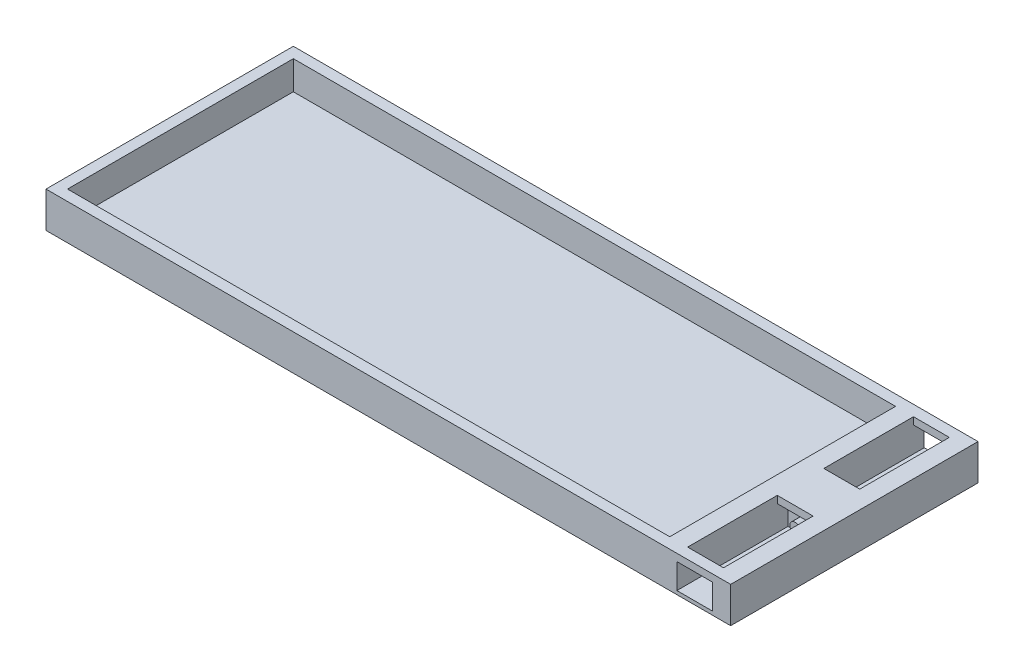
ISO-10303-21;
HEADER;
FILE_DESCRIPTION(('STEP AP214'),'2;1');
FILE_NAME('part.step','',(''),(''),'','','');
FILE_SCHEMA(('AUTOMOTIVE_DESIGN { 1 0 10303 214 1 1 1 1 }'));
ENDSEC;
DATA;
#1=APPLICATION_CONTEXT('core data for automotive mechanical design processes');
#2=APPLICATION_PROTOCOL_DEFINITION('international standard','automotive_design',2000,#1);
#3=PRODUCT_CONTEXT('',#1,'mechanical');
#4=PRODUCT('Part','Part','',(#3));
#5=PRODUCT_RELATED_PRODUCT_CATEGORY('part','',(#4));
#6=PRODUCT_DEFINITION_FORMATION('','',#4);
#7=PRODUCT_DEFINITION_CONTEXT('part definition',#1,'design');
#8=PRODUCT_DEFINITION('design','',#6,#7);
#9=PRODUCT_DEFINITION_SHAPE('','',#8);
#10=(LENGTH_UNIT() NAMED_UNIT(*) SI_UNIT(.MILLI.,.METRE.));
#11=(NAMED_UNIT(*) PLANE_ANGLE_UNIT() SI_UNIT($,.RADIAN.));
#12=(NAMED_UNIT(*) SI_UNIT($,.STERADIAN.) SOLID_ANGLE_UNIT());
#13=UNCERTAINTY_MEASURE_WITH_UNIT(LENGTH_MEASURE(1.E-05),#10,'distance_accuracy_value','');
#14=(GEOMETRIC_REPRESENTATION_CONTEXT(3) GLOBAL_UNCERTAINTY_ASSIGNED_CONTEXT((#13)) GLOBAL_UNIT_ASSIGNED_CONTEXT((#10,
#11,#12)) REPRESENTATION_CONTEXT('',''));
#15=CARTESIAN_POINT('',(0.,0.,0.));
#16=DIRECTION('',(0.,0.,1.));
#17=DIRECTION('',(1.,0.,0.));
#18=AXIS2_PLACEMENT_3D('',#15,#16,#17);
#19=CARTESIAN_POINT('',(-87.,10.,-34.5));
#20=DIRECTION('',(1.,0.,0.));
#21=DIRECTION('',(0.,0.,-1.));
#22=AXIS2_PLACEMENT_3D('',#19,#20,#21);
#23=PLANE('',#22);
#24=DIRECTION('',(0.,-1.,0.));
#25=VECTOR('',#24,1.);
#26=CARTESIAN_POINT('',(-87.,0.,-5.));
#27=LINE('',#26,#25);
#28=CARTESIAN_POINT('',(-87.,5.,-5.));
#29=VERTEX_POINT('',#28);
#30=CARTESIAN_POINT('',(-87.,0.,-5.));
#31=VERTEX_POINT('',#30);
#32=EDGE_CURVE('E59',#29,#31,#27,.T.);
#33=ORIENTED_EDGE('',*,*,#32,.F.);
#34=DIRECTION('',(0.,0.,-1.));
#35=VECTOR('',#34,1.);
#36=CARTESIAN_POINT('',(-87.,5.,-5.));
#37=LINE('',#36,#35);
#38=CARTESIAN_POINT('',(-87.,5.,5.));
#39=VERTEX_POINT('',#38);
#40=EDGE_CURVE('E248',#39,#29,#37,.T.);
#41=ORIENTED_EDGE('',*,*,#40,.F.);
#42=DIRECTION('',(0.,1.,0.));
#43=VECTOR('',#42,1.);
#44=CARTESIAN_POINT('',(-87.,5.,5.));
#45=LINE('',#44,#43);
#46=CARTESIAN_POINT('',(-87.,0.,5.));
#47=VERTEX_POINT('',#46);
#48=EDGE_CURVE('E65',#47,#39,#45,.T.);
#49=ORIENTED_EDGE('',*,*,#48,.F.);
#50=DIRECTION('',(0.,0.,1.));
#51=VECTOR('',#50,1.);
#52=CARTESIAN_POINT('',(-87.,0.,-34.5));
#53=LINE('',#52,#51);
#54=CARTESIAN_POINT('',(-87.,0.,34.5));
#55=VERTEX_POINT('',#54);
#56=EDGE_CURVE('E413',#47,#55,#53,.T.);
#57=ORIENTED_EDGE('',*,*,#56,.T.);
#58=DIRECTION('',(0.,-1.,0.));
#59=VECTOR('',#58,1.);
#60=CARTESIAN_POINT('',(-87.,10.,34.5));
#61=LINE('',#60,#59);
#62=CARTESIAN_POINT('',(-87.,10.,34.5));
#63=VERTEX_POINT('',#62);
#64=EDGE_CURVE('E437',#63,#55,#61,.T.);
#65=ORIENTED_EDGE('',*,*,#64,.F.);
#66=DIRECTION('',(0.,0.,1.));
#67=VECTOR('',#66,1.);
#68=CARTESIAN_POINT('',(-87.,10.,-34.5));
#69=LINE('',#68,#67);
#70=CARTESIAN_POINT('',(-87.,10.,-34.5));
#71=VERTEX_POINT('',#70);
#72=EDGE_CURVE('E416',#71,#63,#69,.T.);
#73=ORIENTED_EDGE('',*,*,#72,.F.);
#74=DIRECTION('',(0.,-1.,0.));
#75=VECTOR('',#74,1.);
#76=CARTESIAN_POINT('',(-87.,10.,-34.5));
#77=LINE('',#76,#75);
#78=CARTESIAN_POINT('',(-87.,0.,-34.5));
#79=VERTEX_POINT('',#78);
#80=EDGE_CURVE('E52',#71,#79,#77,.T.);
#81=ORIENTED_EDGE('',*,*,#80,.T.);
#82=EDGE_CURVE('E425',#79,#31,#53,.T.);
#83=ORIENTED_EDGE('',*,*,#82,.T.);
#84=EDGE_LOOP('',(#33,#41,#49,#57,#65,#73,#81,#83));
#85=FACE_BOUND('',#84,.T.);
#86=ADVANCED_FACE('F45',(#85),#23,.F.);
#87=CARTESIAN_POINT('',(99.,0.,31.5));
#88=DIRECTION('',(-1.,0.,0.));
#89=DIRECTION('',(0.,0.,1.));
#90=AXIS2_PLACEMENT_3D('',#87,#88,#89);
#91=PLANE('',#90);
#92=DIRECTION('',(0.,1.,0.));
#93=VECTOR('',#92,1.);
#94=CARTESIAN_POINT('',(99.,8.,3.49999999999998));
#95=LINE('',#94,#93);
#96=CARTESIAN_POINT('',(99.,1.,3.49999999999998));
#97=VERTEX_POINT('',#96);
#98=CARTESIAN_POINT('',(99.,8.,3.49999999999998));
#99=VERTEX_POINT('',#98);
#100=EDGE_CURVE('E338',#97,#99,#95,.T.);
#101=ORIENTED_EDGE('',*,*,#100,.F.);
#102=DIRECTION('',(0.,0.,-1.));
#103=VECTOR('',#102,1.);
#104=CARTESIAN_POINT('',(99.,1.,34.5));
#105=LINE('',#104,#103);
#106=CARTESIAN_POINT('',(99.,1.,34.5));
#107=VERTEX_POINT('',#106);
#108=EDGE_CURVE('E283',#107,#97,#105,.T.);
#109=ORIENTED_EDGE('',*,*,#108,.F.);
#110=DIRECTION('',(0.,-1.,0.));
#111=VECTOR('',#110,1.);
#112=CARTESIAN_POINT('',(99.,8.,34.5));
#113=LINE('',#112,#111);
#114=CARTESIAN_POINT('',(99.,8.,34.5));
#115=VERTEX_POINT('',#114);
#116=EDGE_CURVE('E324',#115,#107,#113,.T.);
#117=ORIENTED_EDGE('',*,*,#116,.F.);
#118=DIRECTION('',(0.,0.,-1.));
#119=VECTOR('',#118,1.);
#120=CARTESIAN_POINT('',(99.,8.,34.501));
#121=LINE('',#120,#119);
#122=CARTESIAN_POINT('',(99.,8.,31.5));
#123=VERTEX_POINT('',#122);
#124=EDGE_CURVE('E329',#115,#123,#121,.T.);
#125=ORIENTED_EDGE('',*,*,#124,.T.);
#126=DIRECTION('',(0.,1.,0.));
#127=VECTOR('',#126,1.);
#128=CARTESIAN_POINT('',(99.,0.,31.5));
#129=LINE('',#128,#127);
#130=CARTESIAN_POINT('',(99.,10.,31.5));
#131=VERTEX_POINT('',#130);
#132=EDGE_CURVE('E357',#123,#131,#129,.T.);
#133=ORIENTED_EDGE('',*,*,#132,.T.);
#134=DIRECTION('',(0.,0.,1.));
#135=VECTOR('',#134,1.);
#136=CARTESIAN_POINT('',(99.,10.,31.5));
#137=LINE('',#136,#135);
#138=CARTESIAN_POINT('',(99.,10.,6.5));
#139=VERTEX_POINT('',#138);
#140=EDGE_CURVE('E331',#139,#131,#137,.T.);
#141=ORIENTED_EDGE('',*,*,#140,.F.);
#142=DIRECTION('',(0.,1.,0.));
#143=VECTOR('',#142,1.);
#144=CARTESIAN_POINT('',(99.,0.,6.5));
#145=LINE('',#144,#143);
#146=CARTESIAN_POINT('',(99.,8.,6.5));
#147=VERTEX_POINT('',#146);
#148=EDGE_CURVE('E356',#147,#139,#145,.T.);
#149=ORIENTED_EDGE('',*,*,#148,.F.);
#150=DIRECTION('',(0.,0.,1.));
#151=VECTOR('',#150,1.);
#152=CARTESIAN_POINT('',(99.,8.,3.49999999999998));
#153=LINE('',#152,#151);
#154=EDGE_CURVE('E332',#99,#147,#153,.T.);
#155=ORIENTED_EDGE('',*,*,#154,.F.);
#156=EDGE_LOOP('',(#101,#109,#117,#125,#133,#141,#149,#155));
#157=FACE_BOUND('',#156,.T.);
#158=ADVANCED_FACE('F478',(#157),#91,.T.);
#159=CARTESIAN_POINT('',(89.,0.,6.5));
#160=DIRECTION('',(1.,0.,0.));
#161=DIRECTION('',(0.,0.,-1.));
#162=AXIS2_PLACEMENT_3D('',#159,#160,#161);
#163=PLANE('',#162);
#164=DIRECTION('',(0.,1.,0.));
#165=VECTOR('',#164,1.);
#166=CARTESIAN_POINT('',(89.,8.,34.5));
#167=LINE('',#166,#165);
#168=CARTESIAN_POINT('',(89.,1.,34.5));
#169=VERTEX_POINT('',#168);
#170=CARTESIAN_POINT('',(89.,8.,34.5));
#171=VERTEX_POINT('',#170);
#172=EDGE_CURVE('E318',#169,#171,#167,.T.);
#173=ORIENTED_EDGE('',*,*,#172,.F.);
#174=DIRECTION('',(0.,0.,-1.));
#175=VECTOR('',#174,1.);
#176=CARTESIAN_POINT('',(89.,1.,34.5));
#177=LINE('',#176,#175);
#178=CARTESIAN_POINT('',(89.,1.,3.49999999999998));
#179=VERTEX_POINT('',#178);
#180=EDGE_CURVE('E279',#169,#179,#177,.T.);
#181=ORIENTED_EDGE('',*,*,#180,.T.);
#182=DIRECTION('',(0.,-1.,0.));
#183=VECTOR('',#182,1.);
#184=CARTESIAN_POINT('',(89.,8.,3.49999999999998));
#185=LINE('',#184,#183);
#186=CARTESIAN_POINT('',(89.,8.,3.49999999999998));
#187=VERTEX_POINT('',#186);
#188=EDGE_CURVE('E334',#187,#179,#185,.T.);
#189=ORIENTED_EDGE('',*,*,#188,.F.);
#190=DIRECTION('',(0.,0.,1.));
#191=VECTOR('',#190,1.);
#192=CARTESIAN_POINT('',(89.,8.,3.49999999999998));
#193=LINE('',#192,#191);
#194=CARTESIAN_POINT('',(89.,8.,6.49999999999998));
#195=VERTEX_POINT('',#194);
#196=EDGE_CURVE('E301',#187,#195,#193,.T.);
#197=ORIENTED_EDGE('',*,*,#196,.T.);
#198=DIRECTION('',(0.,1.,0.));
#199=VECTOR('',#198,1.);
#200=CARTESIAN_POINT('',(89.,0.,6.5));
#201=LINE('',#200,#199);
#202=CARTESIAN_POINT('',(89.,10.,6.5));
#203=VERTEX_POINT('',#202);
#204=EDGE_CURVE('E362',#195,#203,#201,.T.);
#205=ORIENTED_EDGE('',*,*,#204,.T.);
#206=DIRECTION('',(0.,0.,-1.));
#207=VECTOR('',#206,1.);
#208=CARTESIAN_POINT('',(89.,10.,6.5));
#209=LINE('',#208,#207);
#210=CARTESIAN_POINT('',(89.,10.,31.5));
#211=VERTEX_POINT('',#210);
#212=EDGE_CURVE('E350',#211,#203,#209,.T.);
#213=ORIENTED_EDGE('',*,*,#212,.F.);
#214=DIRECTION('',(0.,1.,0.));
#215=VECTOR('',#214,1.);
#216=CARTESIAN_POINT('',(89.,0.,31.5));
#217=LINE('',#216,#215);
#218=CARTESIAN_POINT('',(89.,8.,31.5));
#219=VERTEX_POINT('',#218);
#220=EDGE_CURVE('E360',#219,#211,#217,.T.);
#221=ORIENTED_EDGE('',*,*,#220,.F.);
#222=DIRECTION('',(0.,0.,-1.));
#223=VECTOR('',#222,1.);
#224=CARTESIAN_POINT('',(89.,8.,34.501));
#225=LINE('',#224,#223);
#226=EDGE_CURVE('E327',#171,#219,#225,.T.);
#227=ORIENTED_EDGE('',*,*,#226,.F.);
#228=EDGE_LOOP('',(#173,#181,#189,#197,#205,#213,#221,#227));
#229=FACE_BOUND('',#228,.T.);
#230=ADVANCED_FACE('F484',(#229),#163,.T.);
#231=CARTESIAN_POINT('',(0.,0.,3.49999999999998));
#232=DIRECTION('',(0.,0.,1.));
#233=DIRECTION('',(1.,0.,0.));
#234=AXIS2_PLACEMENT_3D('',#231,#232,#233);
#235=PLANE('',#234);
#236=CARTESIAN_POINT('',(94.,4.5,3.49999999999998));
#237=DIRECTION('',(0.,0.,1.));
#238=DIRECTION('',(1.,0.,0.));
#239=AXIS2_PLACEMENT_3D('',#236,#237,#238);
#240=CIRCLE('',#239,1.5);
#241=CARTESIAN_POINT('',(95.5,4.5,3.49999999999998));
#242=VERTEX_POINT('',#241);
#243=EDGE_CURVE('E254',#242,#242,#240,.T.);
#244=ORIENTED_EDGE('',*,*,#243,.F.);
#245=EDGE_LOOP('',(#244));
#246=FACE_BOUND('',#245,.T.);
#247=ORIENTED_EDGE('',*,*,#188,.T.);
#248=DIRECTION('',(-1.,0.,0.));
#249=VECTOR('',#248,1.);
#250=CARTESIAN_POINT('',(89.,1.,3.49999999999998));
#251=LINE('',#250,#249);
#252=EDGE_CURVE('E276',#97,#179,#251,.T.);
#253=ORIENTED_EDGE('',*,*,#252,.F.);
#254=ORIENTED_EDGE('',*,*,#100,.T.);
#255=DIRECTION('',(-1.,0.,0.));
#256=VECTOR('',#255,1.);
#257=CARTESIAN_POINT('',(99.,8.,3.49999999999998));
#258=LINE('',#257,#256);
#259=EDGE_CURVE('E341',#99,#187,#258,.T.);
#260=ORIENTED_EDGE('',*,*,#259,.T.);
#261=EDGE_LOOP('',(#247,#253,#254,#260));
#262=FACE_BOUND('',#261,.T.);
#263=ADVANCED_FACE('F491',(#246,#262),#235,.T.);
#264=CARTESIAN_POINT('',(0.,0.,0.));
#265=DIRECTION('',(0.,-1.,0.));
#266=DIRECTION('',(0.,0.,-1.));
#267=AXIS2_PLACEMENT_3D('',#264,#265,#266);
#268=PLANE('',#267);
#269=ORIENTED_EDGE('',*,*,#82,.F.);
#270=DIRECTION('',(-1.,0.,0.));
#271=VECTOR('',#270,1.);
#272=CARTESIAN_POINT('',(84.,0.,-34.5));
#273=LINE('',#272,#271);
#274=CARTESIAN_POINT('',(104.,0.,-34.5));
#275=VERTEX_POINT('',#274);
#276=EDGE_CURVE('E417',#275,#79,#273,.T.);
#277=ORIENTED_EDGE('',*,*,#276,.F.);
#278=DIRECTION('',(0.,0.,-1.));
#279=VECTOR('',#278,1.);
#280=CARTESIAN_POINT('',(104.,0.,-34.5));
#281=LINE('',#280,#279);
#282=CARTESIAN_POINT('',(104.,0.,34.5));
#283=VERTEX_POINT('',#282);
#284=EDGE_CURVE('E429',#283,#275,#281,.T.);
#285=ORIENTED_EDGE('',*,*,#284,.F.);
#286=DIRECTION('',(1.,0.,0.));
#287=VECTOR('',#286,1.);
#288=CARTESIAN_POINT('',(84.,0.,34.5));
#289=LINE('',#288,#287);
#290=EDGE_CURVE('E427',#55,#283,#289,.T.);
#291=ORIENTED_EDGE('',*,*,#290,.F.);
#292=ORIENTED_EDGE('',*,*,#56,.F.);
#293=DIRECTION('',(1.,0.,0.));
#294=VECTOR('',#293,1.);
#295=CARTESIAN_POINT('',(-90.,0.,5.));
#296=LINE('',#295,#294);
#297=CARTESIAN_POINT('',(-90.,0.,5.));
#298=VERTEX_POINT('',#297);
#299=EDGE_CURVE('E235',#298,#47,#296,.T.);
#300=ORIENTED_EDGE('',*,*,#299,.F.);
#301=DIRECTION('',(0.,0.,1.));
#302=VECTOR('',#301,1.);
#303=CARTESIAN_POINT('',(-90.,0.,5.));
#304=LINE('',#303,#302);
#305=CARTESIAN_POINT('',(-90.,0.,-5.));
#306=VERTEX_POINT('',#305);
#307=EDGE_CURVE('E228',#306,#298,#304,.T.);
#308=ORIENTED_EDGE('',*,*,#307,.F.);
#309=DIRECTION('',(1.,0.,0.));
#310=VECTOR('',#309,1.);
#311=CARTESIAN_POINT('',(-90.,0.,-5.));
#312=LINE('',#311,#310);
#313=EDGE_CURVE('E233',#306,#31,#312,.T.);
#314=ORIENTED_EDGE('',*,*,#313,.T.);
#315=EDGE_LOOP('',(#269,#277,#285,#291,#292,#300,#308,#314));
#316=FACE_BOUND('',#315,.T.);
#317=ADVANCED_FACE('F231',(#316),#268,.T.);
#318=CARTESIAN_POINT('',(89.,0.,-6.5));
#319=DIRECTION('',(0.,0.,1.));
#320=DIRECTION('',(1.,0.,0.));
#321=AXIS2_PLACEMENT_3D('',#318,#319,#320);
#322=PLANE('',#321);
#323=DIRECTION('',(-1.,0.,0.));
#324=VECTOR('',#323,1.);
#325=CARTESIAN_POINT('',(99.,8.,-6.49999999999998));
#326=LINE('',#325,#324);
#327=CARTESIAN_POINT('',(99.,8.,-6.49999999999998));
#328=VERTEX_POINT('',#327);
#329=CARTESIAN_POINT('',(89.,8.,-6.49999999999998));
#330=VERTEX_POINT('',#329);
#331=EDGE_CURVE('E285',#328,#330,#326,.T.);
#332=ORIENTED_EDGE('',*,*,#331,.T.);
#333=DIRECTION('',(0.,1.,0.));
#334=VECTOR('',#333,1.);
#335=CARTESIAN_POINT('',(89.,0.,-6.5));
#336=LINE('',#335,#334);
#337=CARTESIAN_POINT('',(89.,10.,-6.5));
#338=VERTEX_POINT('',#337);
#339=EDGE_CURVE('E380',#330,#338,#336,.T.);
#340=ORIENTED_EDGE('',*,*,#339,.T.);
#341=DIRECTION('',(1.,0.,0.));
#342=VECTOR('',#341,1.);
#343=CARTESIAN_POINT('',(89.,10.,-6.5));
#344=LINE('',#343,#342);
#345=CARTESIAN_POINT('',(99.,10.,-6.5));
#346=VERTEX_POINT('',#345);
#347=EDGE_CURVE('E373',#338,#346,#344,.T.);
#348=ORIENTED_EDGE('',*,*,#347,.T.);
#349=DIRECTION('',(0.,1.,0.));
#350=VECTOR('',#349,1.);
#351=CARTESIAN_POINT('',(99.,0.,-6.5));
#352=LINE('',#351,#350);
#353=EDGE_CURVE('E377',#328,#346,#352,.T.);
#354=ORIENTED_EDGE('',*,*,#353,.F.);
#355=EDGE_LOOP('',(#332,#340,#348,#354));
#356=FACE_BOUND('',#355,.T.);
#357=ADVANCED_FACE('F498',(#356),#322,.F.);
#358=CARTESIAN_POINT('',(84.,10.,34.5));
#359=DIRECTION('',(0.,0.,-1.));
#360=DIRECTION('',(-1.,0.,0.));
#361=AXIS2_PLACEMENT_3D('',#358,#359,#360);
#362=PLANE('',#361);
#363=ORIENTED_EDGE('',*,*,#116,.T.);
#364=DIRECTION('',(-1.,0.,0.));
#365=VECTOR('',#364,1.);
#366=CARTESIAN_POINT('',(89.,1.,34.5));
#367=LINE('',#366,#365);
#368=EDGE_CURVE('E277',#107,#169,#367,.T.);
#369=ORIENTED_EDGE('',*,*,#368,.T.);
#370=ORIENTED_EDGE('',*,*,#172,.T.);
#371=DIRECTION('',(1.,0.,0.));
#372=VECTOR('',#371,1.);
#373=CARTESIAN_POINT('',(99.,8.,34.5));
#374=LINE('',#373,#372);
#375=EDGE_CURVE('E321',#171,#115,#374,.T.);
#376=ORIENTED_EDGE('',*,*,#375,.T.);
#377=EDGE_LOOP('',(#363,#369,#370,#376));
#378=FACE_BOUND('',#377,.T.);
#379=ORIENTED_EDGE('',*,*,#290,.T.);
#380=DIRECTION('',(0.,-1.,0.));
#381=VECTOR('',#380,1.);
#382=CARTESIAN_POINT('',(104.,10.,34.5));
#383=LINE('',#382,#381);
#384=CARTESIAN_POINT('',(104.,10.,34.5));
#385=VERTEX_POINT('',#384);
#386=EDGE_CURVE('E434',#385,#283,#383,.T.);
#387=ORIENTED_EDGE('',*,*,#386,.F.);
#388=DIRECTION('',(1.,0.,0.));
#389=VECTOR('',#388,1.);
#390=CARTESIAN_POINT('',(-87.,10.,34.5));
#391=LINE('',#390,#389);
#392=EDGE_CURVE('E419',#63,#385,#391,.T.);
#393=ORIENTED_EDGE('',*,*,#392,.F.);
#394=ORIENTED_EDGE('',*,*,#64,.T.);
#395=EDGE_LOOP('',(#379,#387,#393,#394));
#396=FACE_BOUND('',#395,.T.);
#397=ADVANCED_FACE('F455',(#378,#396),#362,.F.);
#398=CARTESIAN_POINT('',(89.,0.,31.5));
#399=DIRECTION('',(0.,0.,-1.));
#400=DIRECTION('',(-1.,0.,0.));
#401=AXIS2_PLACEMENT_3D('',#398,#399,#400);
#402=PLANE('',#401);
#403=ORIENTED_EDGE('',*,*,#132,.F.);
#404=DIRECTION('',(1.,0.,0.));
#405=VECTOR('',#404,1.);
#406=CARTESIAN_POINT('',(99.,8.,31.5));
#407=LINE('',#406,#405);
#408=EDGE_CURVE('E315',#219,#123,#407,.T.);
#409=ORIENTED_EDGE('',*,*,#408,.F.);
#410=ORIENTED_EDGE('',*,*,#220,.T.);
#411=DIRECTION('',(-1.,0.,0.));
#412=VECTOR('',#411,1.);
#413=CARTESIAN_POINT('',(89.,10.,31.5));
#414=LINE('',#413,#412);
#415=EDGE_CURVE('E353',#131,#211,#414,.T.);
#416=ORIENTED_EDGE('',*,*,#415,.F.);
#417=EDGE_LOOP('',(#403,#409,#410,#416));
#418=FACE_BOUND('',#417,.T.);
#419=ADVANCED_FACE('F537',(#418),#402,.T.);
#420=CARTESIAN_POINT('',(0.,10.,0.));
#421=DIRECTION('',(0.,-1.,0.));
#422=DIRECTION('',(0.,0.,-1.));
#423=AXIS2_PLACEMENT_3D('',#420,#421,#422);
#424=PLANE('',#423);
#425=DIRECTION('',(0.,0.,-1.));
#426=VECTOR('',#425,1.);
#427=CARTESIAN_POINT('',(84.,10.,31.5));
#428=LINE('',#427,#426);
#429=CARTESIAN_POINT('',(84.,10.,31.5));
#430=VERTEX_POINT('',#429);
#431=CARTESIAN_POINT('',(84.,10.,-31.5));
#432=VERTEX_POINT('',#431);
#433=EDGE_CURVE('E392',#430,#432,#428,.T.);
#434=ORIENTED_EDGE('',*,*,#433,.F.);
#435=DIRECTION('',(1.,0.,0.));
#436=VECTOR('',#435,1.);
#437=CARTESIAN_POINT('',(-84.,10.,31.5));
#438=LINE('',#437,#436);
#439=CARTESIAN_POINT('',(-84.,10.,31.5));
#440=VERTEX_POINT('',#439);
#441=EDGE_CURVE('E399',#440,#430,#438,.T.);
#442=ORIENTED_EDGE('',*,*,#441,.F.);
#443=DIRECTION('',(0.,0.,1.));
#444=VECTOR('',#443,1.);
#445=CARTESIAN_POINT('',(-84.,10.,31.5));
#446=LINE('',#445,#444);
#447=CARTESIAN_POINT('',(-84.,10.,-31.5));
#448=VERTEX_POINT('',#447);
#449=EDGE_CURVE('E396',#448,#440,#446,.T.);
#450=ORIENTED_EDGE('',*,*,#449,.F.);
#451=DIRECTION('',(-1.,0.,0.));
#452=VECTOR('',#451,1.);
#453=CARTESIAN_POINT('',(-84.,10.,-31.5));
#454=LINE('',#453,#452);
#455=EDGE_CURVE('E394',#432,#448,#454,.T.);
#456=ORIENTED_EDGE('',*,*,#455,.F.);
#457=EDGE_LOOP('',(#434,#442,#450,#456));
#458=FACE_BOUND('',#457,.T.);
#459=DIRECTION('',(-1.,0.,0.));
#460=VECTOR('',#459,1.);
#461=CARTESIAN_POINT('',(0.,10.,-34.5));
#462=LINE('',#461,#460);
#463=CARTESIAN_POINT('',(104.,10.,-34.5));
#464=VERTEX_POINT('',#463);
#465=EDGE_CURVE('E414',#464,#71,#462,.T.);
#466=ORIENTED_EDGE('',*,*,#465,.T.);
#467=ORIENTED_EDGE('',*,*,#72,.T.);
#468=ORIENTED_EDGE('',*,*,#392,.T.);
#469=DIRECTION('',(0.,0.,-1.));
#470=VECTOR('',#469,1.);
#471=CARTESIAN_POINT('',(104.,10.,-34.5));
#472=LINE('',#471,#470);
#473=EDGE_CURVE('E421',#385,#464,#472,.T.);
#474=ORIENTED_EDGE('',*,*,#473,.T.);
#475=EDGE_LOOP('',(#466,#467,#468,#474));
#476=FACE_BOUND('',#475,.T.);
#477=DIRECTION('',(-1.,0.,0.));
#478=VECTOR('',#477,1.);
#479=CARTESIAN_POINT('',(89.,10.,-31.5));
#480=LINE('',#479,#478);
#481=CARTESIAN_POINT('',(99.,10.,-31.5));
#482=VERTEX_POINT('',#481);
#483=CARTESIAN_POINT('',(89.,10.,-31.5));
#484=VERTEX_POINT('',#483);
#485=EDGE_CURVE('E367',#482,#484,#480,.T.);
#486=ORIENTED_EDGE('',*,*,#485,.F.);
#487=DIRECTION('',(0.,0.,-1.));
#488=VECTOR('',#487,1.);
#489=CARTESIAN_POINT('',(99.,10.,-31.5));
#490=LINE('',#489,#488);
#491=EDGE_CURVE('E359',#346,#482,#490,.T.);
#492=ORIENTED_EDGE('',*,*,#491,.F.);
#493=ORIENTED_EDGE('',*,*,#347,.F.);
#494=DIRECTION('',(0.,0.,1.));
#495=VECTOR('',#494,1.);
#496=CARTESIAN_POINT('',(89.,10.,-6.5));
#497=LINE('',#496,#495);
#498=EDGE_CURVE('E370',#484,#338,#497,.T.);
#499=ORIENTED_EDGE('',*,*,#498,.F.);
#500=EDGE_LOOP('',(#486,#492,#493,#499));
#501=FACE_BOUND('',#500,.T.);
#502=ORIENTED_EDGE('',*,*,#140,.T.);
#503=ORIENTED_EDGE('',*,*,#415,.T.);
#504=ORIENTED_EDGE('',*,*,#212,.T.);
#505=DIRECTION('',(1.,0.,0.));
#506=VECTOR('',#505,1.);
#507=CARTESIAN_POINT('',(89.,10.,6.5));
#508=LINE('',#507,#506);
#509=EDGE_CURVE('E347',#203,#139,#508,.T.);
#510=ORIENTED_EDGE('',*,*,#509,.T.);
#511=EDGE_LOOP('',(#502,#503,#504,#510));
#512=FACE_BOUND('',#511,.T.);
#513=ADVANCED_FACE('F533',(#458,#476,#501,#512),#424,.F.);
#514=CARTESIAN_POINT('',(84.,10.,31.5));
#515=DIRECTION('',(-1.,0.,0.));
#516=DIRECTION('',(0.,0.,1.));
#517=AXIS2_PLACEMENT_3D('',#514,#515,#516);
#518=PLANE('',#517);
#519=DIRECTION('',(0.,-1.,0.));
#520=VECTOR('',#519,1.);
#521=CARTESIAN_POINT('',(84.,10.,-31.5));
#522=LINE('',#521,#520);
#523=CARTESIAN_POINT('',(84.,2.,-31.5));
#524=VERTEX_POINT('',#523);
#525=EDGE_CURVE('E410',#432,#524,#522,.T.);
#526=ORIENTED_EDGE('',*,*,#525,.T.);
#527=DIRECTION('',(0.,0.,-1.));
#528=VECTOR('',#527,1.);
#529=CARTESIAN_POINT('',(84.,2.,31.5));
#530=LINE('',#529,#528);
#531=CARTESIAN_POINT('',(84.,2.,31.5));
#532=VERTEX_POINT('',#531);
#533=EDGE_CURVE('E379',#532,#524,#530,.T.);
#534=ORIENTED_EDGE('',*,*,#533,.F.);
#535=DIRECTION('',(0.,-1.,0.));
#536=VECTOR('',#535,1.);
#537=CARTESIAN_POINT('',(84.,10.,31.5));
#538=LINE('',#537,#536);
#539=EDGE_CURVE('E401',#430,#532,#538,.T.);
#540=ORIENTED_EDGE('',*,*,#539,.F.);
#541=ORIENTED_EDGE('',*,*,#433,.T.);
#542=EDGE_LOOP('',(#526,#534,#540,#541));
#543=FACE_BOUND('',#542,.T.);
#544=ADVANCED_FACE('F529',(#543),#518,.T.);
#545=CARTESIAN_POINT('',(-84.,10.,-31.5));
#546=DIRECTION('',(0.,0.,1.));
#547=DIRECTION('',(1.,0.,0.));
#548=AXIS2_PLACEMENT_3D('',#545,#546,#547);
#549=PLANE('',#548);
#550=DIRECTION('',(0.,-1.,0.));
#551=VECTOR('',#550,1.);
#552=CARTESIAN_POINT('',(-84.,10.,-31.5));
#553=LINE('',#552,#551);
#554=CARTESIAN_POINT('',(-84.,2.,-31.5));
#555=VERTEX_POINT('',#554);
#556=EDGE_CURVE('E407',#448,#555,#553,.T.);
#557=ORIENTED_EDGE('',*,*,#556,.T.);
#558=DIRECTION('',(-1.,0.,0.));
#559=VECTOR('',#558,1.);
#560=CARTESIAN_POINT('',(-84.,2.,-31.5));
#561=LINE('',#560,#559);
#562=EDGE_CURVE('E386',#524,#555,#561,.T.);
#563=ORIENTED_EDGE('',*,*,#562,.F.);
#564=ORIENTED_EDGE('',*,*,#525,.F.);
#565=ORIENTED_EDGE('',*,*,#455,.T.);
#566=EDGE_LOOP('',(#557,#563,#564,#565));
#567=FACE_BOUND('',#566,.T.);
#568=ADVANCED_FACE('F525',(#567),#549,.T.);
#569=CARTESIAN_POINT('',(-84.,10.,31.5));
#570=DIRECTION('',(1.,0.,0.));
#571=DIRECTION('',(0.,0.,-1.));
#572=AXIS2_PLACEMENT_3D('',#569,#570,#571);
#573=PLANE('',#572);
#574=DIRECTION('',(0.,-1.,0.));
#575=VECTOR('',#574,1.);
#576=CARTESIAN_POINT('',(-84.,10.,31.5));
#577=LINE('',#576,#575);
#578=CARTESIAN_POINT('',(-84.,2.,31.5));
#579=VERTEX_POINT('',#578);
#580=EDGE_CURVE('E404',#440,#579,#577,.T.);
#581=ORIENTED_EDGE('',*,*,#580,.T.);
#582=DIRECTION('',(0.,0.,1.));
#583=VECTOR('',#582,1.);
#584=CARTESIAN_POINT('',(-84.,2.,31.5));
#585=LINE('',#584,#583);
#586=EDGE_CURVE('E388',#555,#579,#585,.T.);
#587=ORIENTED_EDGE('',*,*,#586,.F.);
#588=ORIENTED_EDGE('',*,*,#556,.F.);
#589=ORIENTED_EDGE('',*,*,#449,.T.);
#590=EDGE_LOOP('',(#581,#587,#588,#589));
#591=FACE_BOUND('',#590,.T.);
#592=ADVANCED_FACE('F521',(#591),#573,.T.);
#593=CARTESIAN_POINT('',(-84.,10.,31.5));
#594=DIRECTION('',(0.,0.,-1.));
#595=DIRECTION('',(-1.,0.,0.));
#596=AXIS2_PLACEMENT_3D('',#593,#594,#595);
#597=PLANE('',#596);
#598=ORIENTED_EDGE('',*,*,#539,.T.);
#599=DIRECTION('',(1.,0.,0.));
#600=VECTOR('',#599,1.);
#601=CARTESIAN_POINT('',(-84.,2.,31.5));
#602=LINE('',#601,#600);
#603=EDGE_CURVE('E390',#579,#532,#602,.T.);
#604=ORIENTED_EDGE('',*,*,#603,.F.);
#605=ORIENTED_EDGE('',*,*,#580,.F.);
#606=ORIENTED_EDGE('',*,*,#441,.T.);
#607=EDGE_LOOP('',(#598,#604,#605,#606));
#608=FACE_BOUND('',#607,.T.);
#609=ADVANCED_FACE('F518',(#608),#597,.T.);
#610=CARTESIAN_POINT('',(104.,10.,-34.5));
#611=DIRECTION('',(-1.,0.,0.));
#612=DIRECTION('',(0.,0.,1.));
#613=AXIS2_PLACEMENT_3D('',#610,#611,#612);
#614=PLANE('',#613);
#615=ORIENTED_EDGE('',*,*,#284,.T.);
#616=DIRECTION('',(0.,-1.,0.));
#617=VECTOR('',#616,1.);
#618=CARTESIAN_POINT('',(104.,10.,-34.5));
#619=LINE('',#618,#617);
#620=EDGE_CURVE('E424',#464,#275,#619,.T.);
#621=ORIENTED_EDGE('',*,*,#620,.F.);
#622=ORIENTED_EDGE('',*,*,#473,.F.);
#623=ORIENTED_EDGE('',*,*,#386,.T.);
#624=EDGE_LOOP('',(#615,#621,#622,#623));
#625=FACE_BOUND('',#624,.T.);
#626=ADVANCED_FACE('F451',(#625),#614,.F.);
#627=CARTESIAN_POINT('',(84.,10.,-34.5));
#628=DIRECTION('',(0.,0.,1.));
#629=DIRECTION('',(1.,0.,0.));
#630=AXIS2_PLACEMENT_3D('',#627,#628,#629);
#631=PLANE('',#630);
#632=DIRECTION('',(-1.,0.,0.));
#633=VECTOR('',#632,1.);
#634=CARTESIAN_POINT('',(89.,1.,-34.5));
#635=LINE('',#634,#633);
#636=CARTESIAN_POINT('',(99.,1.,-34.5));
#637=VERTEX_POINT('',#636);
#638=CARTESIAN_POINT('',(89.,1.,-34.5));
#639=VERTEX_POINT('',#638);
#640=EDGE_CURVE('E266',#637,#639,#635,.T.);
#641=ORIENTED_EDGE('',*,*,#640,.F.);
#642=DIRECTION('',(0.,-1.,0.));
#643=VECTOR('',#642,1.);
#644=CARTESIAN_POINT('',(99.,8.,-34.5));
#645=LINE('',#644,#643);
#646=CARTESIAN_POINT('',(99.,8.,-34.5));
#647=VERTEX_POINT('',#646);
#648=EDGE_CURVE('E288',#647,#637,#645,.T.);
#649=ORIENTED_EDGE('',*,*,#648,.F.);
#650=DIRECTION('',(1.,0.,0.));
#651=VECTOR('',#650,1.);
#652=CARTESIAN_POINT('',(99.,8.,-34.5));
#653=LINE('',#652,#651);
#654=CARTESIAN_POINT('',(89.,8.,-34.5));
#655=VERTEX_POINT('',#654);
#656=EDGE_CURVE('E298',#655,#647,#653,.T.);
#657=ORIENTED_EDGE('',*,*,#656,.F.);
#658=DIRECTION('',(0.,1.,0.));
#659=VECTOR('',#658,1.);
#660=CARTESIAN_POINT('',(89.,8.,-34.5));
#661=LINE('',#660,#659);
#662=EDGE_CURVE('E286',#639,#655,#661,.T.);
#663=ORIENTED_EDGE('',*,*,#662,.F.);
#664=EDGE_LOOP('',(#641,#649,#657,#663));
#665=FACE_BOUND('',#664,.T.);
#666=ORIENTED_EDGE('',*,*,#276,.T.);
#667=ORIENTED_EDGE('',*,*,#80,.F.);
#668=ORIENTED_EDGE('',*,*,#465,.F.);
#669=ORIENTED_EDGE('',*,*,#620,.T.);
#670=EDGE_LOOP('',(#666,#667,#668,#669));
#671=FACE_BOUND('',#670,.T.);
#672=ADVANCED_FACE('F447',(#665,#671),#631,.F.);
#673=CARTESIAN_POINT('',(0.,2.,0.));
#674=DIRECTION('',(0.,-1.,0.));
#675=DIRECTION('',(0.,0.,-1.));
#676=AXIS2_PLACEMENT_3D('',#673,#674,#675);
#677=PLANE('',#676);
#678=ORIENTED_EDGE('',*,*,#533,.T.);
#679=ORIENTED_EDGE('',*,*,#562,.T.);
#680=ORIENTED_EDGE('',*,*,#586,.T.);
#681=ORIENTED_EDGE('',*,*,#603,.T.);
#682=EDGE_LOOP('',(#678,#679,#680,#681));
#683=FACE_BOUND('',#682,.T.);
#684=ADVANCED_FACE('F513',(#683),#677,.F.);
#685=CARTESIAN_POINT('',(99.,0.,-31.5));
#686=DIRECTION('',(1.,0.,0.));
#687=DIRECTION('',(0.,0.,-1.));
#688=AXIS2_PLACEMENT_3D('',#685,#686,#687);
#689=PLANE('',#688);
#690=ORIENTED_EDGE('',*,*,#648,.T.);
#691=DIRECTION('',(0.,0.,1.));
#692=VECTOR('',#691,1.);
#693=CARTESIAN_POINT('',(99.,1.,-34.5));
#694=LINE('',#693,#692);
#695=CARTESIAN_POINT('',(99.,1.,-3.49999999999998));
#696=VERTEX_POINT('',#695);
#697=EDGE_CURVE('E269',#637,#696,#694,.T.);
#698=ORIENTED_EDGE('',*,*,#697,.T.);
#699=DIRECTION('',(0.,1.,0.));
#700=VECTOR('',#699,1.);
#701=CARTESIAN_POINT('',(99.,8.,-3.49999999999998));
#702=LINE('',#701,#700);
#703=CARTESIAN_POINT('',(99.,8.,-3.49999999999998));
#704=VERTEX_POINT('',#703);
#705=EDGE_CURVE('E302',#696,#704,#702,.T.);
#706=ORIENTED_EDGE('',*,*,#705,.T.);
#707=DIRECTION('',(0.,0.,-1.));
#708=VECTOR('',#707,1.);
#709=CARTESIAN_POINT('',(99.,8.,-3.49999999999998));
#710=LINE('',#709,#708);
#711=EDGE_CURVE('E289',#704,#328,#710,.T.);
#712=ORIENTED_EDGE('',*,*,#711,.T.);
#713=ORIENTED_EDGE('',*,*,#353,.T.);
#714=ORIENTED_EDGE('',*,*,#491,.T.);
#715=DIRECTION('',(0.,1.,0.));
#716=VECTOR('',#715,1.);
#717=CARTESIAN_POINT('',(99.,0.,-31.5));
#718=LINE('',#717,#716);
#719=CARTESIAN_POINT('',(99.,8.,-31.5));
#720=VERTEX_POINT('',#719);
#721=EDGE_CURVE('E376',#720,#482,#718,.T.);
#722=ORIENTED_EDGE('',*,*,#721,.F.);
#723=DIRECTION('',(0.,0.,1.));
#724=VECTOR('',#723,1.);
#725=CARTESIAN_POINT('',(99.,8.,-34.501));
#726=LINE('',#725,#724);
#727=EDGE_CURVE('E291',#647,#720,#726,.T.);
#728=ORIENTED_EDGE('',*,*,#727,.F.);
#729=EDGE_LOOP('',(#690,#698,#706,#712,#713,#714,#722,#728));
#730=FACE_BOUND('',#729,.T.);
#731=ADVANCED_FACE('F506',(#730),#689,.F.);
#732=CARTESIAN_POINT('',(89.,0.,-6.5));
#733=DIRECTION('',(-1.,0.,0.));
#734=DIRECTION('',(0.,0.,1.));
#735=AXIS2_PLACEMENT_3D('',#732,#733,#734);
#736=PLANE('',#735);
#737=DIRECTION('',(0.,-1.,0.));
#738=VECTOR('',#737,1.);
#739=CARTESIAN_POINT('',(89.,8.,-3.49999999999998));
#740=LINE('',#739,#738);
#741=CARTESIAN_POINT('',(89.,8.,-3.49999999999998));
#742=VERTEX_POINT('',#741);
#743=CARTESIAN_POINT('',(89.,1.,-3.49999999999998));
#744=VERTEX_POINT('',#743);
#745=EDGE_CURVE('E304',#742,#744,#740,.T.);
#746=ORIENTED_EDGE('',*,*,#745,.T.);
#747=DIRECTION('',(0.,0.,1.));
#748=VECTOR('',#747,1.);
#749=CARTESIAN_POINT('',(89.,1.,-34.5));
#750=LINE('',#749,#748);
#751=EDGE_CURVE('E273',#639,#744,#750,.T.);
#752=ORIENTED_EDGE('',*,*,#751,.F.);
#753=ORIENTED_EDGE('',*,*,#662,.T.);
#754=DIRECTION('',(0.,0.,1.));
#755=VECTOR('',#754,1.);
#756=CARTESIAN_POINT('',(89.,8.,-34.501));
#757=LINE('',#756,#755);
#758=CARTESIAN_POINT('',(89.,8.,-31.5));
#759=VERTEX_POINT('',#758);
#760=EDGE_CURVE('E293',#655,#759,#757,.T.);
#761=ORIENTED_EDGE('',*,*,#760,.T.);
#762=DIRECTION('',(0.,1.,0.));
#763=VECTOR('',#762,1.);
#764=CARTESIAN_POINT('',(89.,0.,-31.5));
#765=LINE('',#764,#763);
#766=EDGE_CURVE('E382',#759,#484,#765,.T.);
#767=ORIENTED_EDGE('',*,*,#766,.T.);
#768=ORIENTED_EDGE('',*,*,#498,.T.);
#769=ORIENTED_EDGE('',*,*,#339,.F.);
#770=DIRECTION('',(0.,0.,-1.));
#771=VECTOR('',#770,1.);
#772=CARTESIAN_POINT('',(89.,8.,-3.49999999999998));
#773=LINE('',#772,#771);
#774=EDGE_CURVE('E309',#742,#330,#773,.T.);
#775=ORIENTED_EDGE('',*,*,#774,.F.);
#776=EDGE_LOOP('',(#746,#752,#753,#761,#767,#768,#769,#775));
#777=FACE_BOUND('',#776,.T.);
#778=ADVANCED_FACE('F502',(#777),#736,.F.);
#779=CARTESIAN_POINT('',(89.,0.,-31.5));
#780=DIRECTION('',(0.,0.,-1.));
#781=DIRECTION('',(-1.,0.,0.));
#782=AXIS2_PLACEMENT_3D('',#779,#780,#781);
#783=PLANE('',#782);
#784=ORIENTED_EDGE('',*,*,#766,.F.);
#785=DIRECTION('',(-1.,0.,0.));
#786=VECTOR('',#785,1.);
#787=CARTESIAN_POINT('',(99.,8.,-31.5));
#788=LINE('',#787,#786);
#789=EDGE_CURVE('E295',#720,#759,#788,.T.);
#790=ORIENTED_EDGE('',*,*,#789,.F.);
#791=ORIENTED_EDGE('',*,*,#721,.T.);
#792=ORIENTED_EDGE('',*,*,#485,.T.);
#793=EDGE_LOOP('',(#784,#790,#791,#792));
#794=FACE_BOUND('',#793,.T.);
#795=ADVANCED_FACE('F505',(#794),#783,.F.);
#796=CARTESIAN_POINT('',(89.,0.,6.5));
#797=DIRECTION('',(0.,0.,1.));
#798=DIRECTION('',(1.,0.,0.));
#799=AXIS2_PLACEMENT_3D('',#796,#797,#798);
#800=PLANE('',#799);
#801=DIRECTION('',(-1.,0.,0.));
#802=VECTOR('',#801,1.);
#803=CARTESIAN_POINT('',(99.,8.,6.49999999999998));
#804=LINE('',#803,#802);
#805=EDGE_CURVE('E319',#147,#195,#804,.T.);
#806=ORIENTED_EDGE('',*,*,#805,.F.);
#807=ORIENTED_EDGE('',*,*,#148,.T.);
#808=ORIENTED_EDGE('',*,*,#509,.F.);
#809=ORIENTED_EDGE('',*,*,#204,.F.);
#810=EDGE_LOOP('',(#806,#807,#808,#809));
#811=FACE_BOUND('',#810,.T.);
#812=ADVANCED_FACE('F497',(#811),#800,.T.);
#813=CARTESIAN_POINT('',(99.,8.,3.49999999999998));
#814=DIRECTION('',(0.,1.,0.));
#815=DIRECTION('',(0.,0.,1.));
#816=AXIS2_PLACEMENT_3D('',#813,#814,#815);
#817=PLANE('',#816);
#818=ORIENTED_EDGE('',*,*,#805,.T.);
#819=ORIENTED_EDGE('',*,*,#196,.F.);
#820=ORIENTED_EDGE('',*,*,#259,.F.);
#821=ORIENTED_EDGE('',*,*,#154,.T.);
#822=EDGE_LOOP('',(#818,#819,#820,#821));
#823=FACE_BOUND('',#822,.T.);
#824=ADVANCED_FACE('F573',(#823),#817,.F.);
#825=CARTESIAN_POINT('',(99.,8.,34.501));
#826=DIRECTION('',(0.,-1.,0.));
#827=DIRECTION('',(0.,0.,-1.));
#828=AXIS2_PLACEMENT_3D('',#825,#826,#827);
#829=PLANE('',#828);
#830=ORIENTED_EDGE('',*,*,#226,.T.);
#831=ORIENTED_EDGE('',*,*,#408,.T.);
#832=ORIENTED_EDGE('',*,*,#124,.F.);
#833=ORIENTED_EDGE('',*,*,#375,.F.);
#834=EDGE_LOOP('',(#830,#831,#832,#833));
#835=FACE_BOUND('',#834,.T.);
#836=ADVANCED_FACE('F557',(#835),#829,.T.);
#837=CARTESIAN_POINT('',(99.,8.,-34.501));
#838=DIRECTION('',(0.,1.,0.));
#839=DIRECTION('',(0.,0.,1.));
#840=AXIS2_PLACEMENT_3D('',#837,#838,#839);
#841=PLANE('',#840);
#842=ORIENTED_EDGE('',*,*,#656,.T.);
#843=ORIENTED_EDGE('',*,*,#727,.T.);
#844=ORIENTED_EDGE('',*,*,#789,.T.);
#845=ORIENTED_EDGE('',*,*,#760,.F.);
#846=EDGE_LOOP('',(#842,#843,#844,#845));
#847=FACE_BOUND('',#846,.T.);
#848=ADVANCED_FACE('F596',(#847),#841,.F.);
#849=CARTESIAN_POINT('',(99.,8.,-3.49999999999998));
#850=DIRECTION('',(0.,-1.,0.));
#851=DIRECTION('',(0.,0.,-1.));
#852=AXIS2_PLACEMENT_3D('',#849,#850,#851);
#853=PLANE('',#852);
#854=ORIENTED_EDGE('',*,*,#331,.F.);
#855=ORIENTED_EDGE('',*,*,#711,.F.);
#856=DIRECTION('',(-1.,0.,0.));
#857=VECTOR('',#856,1.);
#858=CARTESIAN_POINT('',(99.,8.,-3.49999999999998));
#859=LINE('',#858,#857);
#860=EDGE_CURVE('E307',#704,#742,#859,.T.);
#861=ORIENTED_EDGE('',*,*,#860,.T.);
#862=ORIENTED_EDGE('',*,*,#774,.T.);
#863=EDGE_LOOP('',(#854,#855,#861,#862));
#864=FACE_BOUND('',#863,.T.);
#865=ADVANCED_FACE('F591',(#864),#853,.T.);
#866=CARTESIAN_POINT('',(0.,0.,-3.49999999999998));
#867=DIRECTION('',(0.,0.,-1.));
#868=DIRECTION('',(1.,0.,0.));
#869=AXIS2_PLACEMENT_3D('',#866,#867,#868);
#870=PLANE('',#869);
#871=CARTESIAN_POINT('',(94.,4.5,-3.49999999999998));
#872=DIRECTION('',(0.,0.,-1.));
#873=DIRECTION('',(-1.,0.,0.));
#874=AXIS2_PLACEMENT_3D('',#871,#872,#873);
#875=CIRCLE('',#874,1.5);
#876=CARTESIAN_POINT('',(92.5,4.5,-3.49999999999998));
#877=VERTEX_POINT('',#876);
#878=EDGE_CURVE('E11',#877,#877,#875,.T.);
#879=ORIENTED_EDGE('',*,*,#878,.F.);
#880=EDGE_LOOP('',(#879));
#881=FACE_BOUND('',#880,.T.);
#882=DIRECTION('',(-1.,0.,0.));
#883=VECTOR('',#882,1.);
#884=CARTESIAN_POINT('',(89.,1.,-3.49999999999998));
#885=LINE('',#884,#883);
#886=EDGE_CURVE('E263',#696,#744,#885,.T.);
#887=ORIENTED_EDGE('',*,*,#886,.T.);
#888=ORIENTED_EDGE('',*,*,#745,.F.);
#889=ORIENTED_EDGE('',*,*,#860,.F.);
#890=ORIENTED_EDGE('',*,*,#705,.F.);
#891=EDGE_LOOP('',(#887,#888,#889,#890));
#892=FACE_BOUND('',#891,.T.);
#893=ADVANCED_FACE('F582',(#881,#892),#870,.T.);
#894=CARTESIAN_POINT('',(89.,1.,34.5));
#895=DIRECTION('',(0.,-1.,0.));
#896=DIRECTION('',(0.,0.,-1.));
#897=AXIS2_PLACEMENT_3D('',#894,#895,#896);
#898=PLANE('',#897);
#899=ORIENTED_EDGE('',*,*,#252,.T.);
#900=ORIENTED_EDGE('',*,*,#180,.F.);
#901=ORIENTED_EDGE('',*,*,#368,.F.);
#902=ORIENTED_EDGE('',*,*,#108,.T.);
#903=EDGE_LOOP('',(#899,#900,#901,#902));
#904=FACE_BOUND('',#903,.T.);
#905=ADVANCED_FACE('F579',(#904),#898,.F.);
#906=CARTESIAN_POINT('',(89.,1.,-34.5));
#907=DIRECTION('',(0.,1.,0.));
#908=DIRECTION('',(0.,0.,1.));
#909=AXIS2_PLACEMENT_3D('',#906,#907,#908);
#910=PLANE('',#909);
#911=ORIENTED_EDGE('',*,*,#886,.F.);
#912=ORIENTED_EDGE('',*,*,#697,.F.);
#913=ORIENTED_EDGE('',*,*,#640,.T.);
#914=ORIENTED_EDGE('',*,*,#751,.T.);
#915=EDGE_LOOP('',(#911,#912,#913,#914));
#916=FACE_BOUND('',#915,.T.);
#917=ADVANCED_FACE('F581',(#916),#910,.T.);
#918=CARTESIAN_POINT('',(94.,4.5,6.49999999999998));
#919=DIRECTION('',(0.,0.,-1.));
#920=DIRECTION('',(-1.,0.,0.));
#921=AXIS2_PLACEMENT_3D('',#918,#919,#920);
#922=CYLINDRICAL_SURFACE('',#921,1.5);
#923=CARTESIAN_POINT('',(94.,4.5,6.49999999999998));
#924=DIRECTION('',(0.,0.,1.));
#925=DIRECTION('',(1.,0.,0.));
#926=AXIS2_PLACEMENT_3D('',#923,#924,#925);
#927=CIRCLE('',#926,1.5);
#928=CARTESIAN_POINT('',(95.5,4.5,6.49999999999998));
#929=VERTEX_POINT('',#928);
#930=EDGE_CURVE('E260',#929,#929,#927,.T.);
#931=ORIENTED_EDGE('',*,*,#930,.F.);
#932=EDGE_LOOP('',(#931));
#933=FACE_BOUND('',#932,.T.);
#934=ORIENTED_EDGE('',*,*,#243,.T.);
#935=EDGE_LOOP('',(#934));
#936=FACE_BOUND('',#935,.T.);
#937=ADVANCED_FACE('F587',(#933,#936),#922,.T.);
#938=CARTESIAN_POINT('',(94.,4.5,6.49999999999998));
#939=DIRECTION('',(0.,0.,1.));
#940=DIRECTION('',(1.,0.,0.));
#941=AXIS2_PLACEMENT_3D('',#938,#939,#940);
#942=PLANE('',#941);
#943=ORIENTED_EDGE('',*,*,#930,.T.);
#944=EDGE_LOOP('',(#943));
#945=FACE_BOUND('',#944,.T.);
#946=ADVANCED_FACE('F613',(#945),#942,.T.);
#947=CARTESIAN_POINT('',(94.,4.5,-6.49999999999998));
#948=DIRECTION('',(0.,0.,1.));
#949=DIRECTION('',(1.,0.,0.));
#950=AXIS2_PLACEMENT_3D('',#947,#948,#949);
#951=CYLINDRICAL_SURFACE('',#950,1.5);
#952=CARTESIAN_POINT('',(94.,4.5,-6.49999999999998));
#953=DIRECTION('',(0.,0.,1.));
#954=DIRECTION('',(1.,0.,0.));
#955=AXIS2_PLACEMENT_3D('',#952,#953,#954);
#956=CIRCLE('',#955,1.5);
#957=CARTESIAN_POINT('',(95.5,4.5,-6.49999999999998));
#958=VERTEX_POINT('',#957);
#959=EDGE_CURVE('E251',#958,#958,#956,.T.);
#960=ORIENTED_EDGE('',*,*,#959,.T.);
#961=EDGE_LOOP('',(#960));
#962=FACE_BOUND('',#961,.T.);
#963=ORIENTED_EDGE('',*,*,#878,.T.);
#964=EDGE_LOOP('',(#963));
#965=FACE_BOUND('',#964,.T.);
#966=ADVANCED_FACE('F618',(#962,#965),#951,.T.);
#967=CARTESIAN_POINT('',(94.,4.5,-6.49999999999998));
#968=DIRECTION('',(0.,0.,-1.));
#969=DIRECTION('',(1.,0.,0.));
#970=AXIS2_PLACEMENT_3D('',#967,#968,#969);
#971=PLANE('',#970);
#972=ORIENTED_EDGE('',*,*,#959,.F.);
#973=EDGE_LOOP('',(#972));
#974=FACE_BOUND('',#973,.T.);
#975=ADVANCED_FACE('F625',(#974),#971,.T.);
#976=CARTESIAN_POINT('',(-90.,0.,-5.));
#977=DIRECTION('',(0.,0.,1.));
#978=DIRECTION('',(1.,0.,0.));
#979=AXIS2_PLACEMENT_3D('',#976,#977,#978);
#980=PLANE('',#979);
#981=ORIENTED_EDGE('',*,*,#32,.T.);
#982=ORIENTED_EDGE('',*,*,#313,.F.);
#983=DIRECTION('',(0.,-1.,0.));
#984=VECTOR('',#983,1.);
#985=CARTESIAN_POINT('',(-90.,0.,-5.));
#986=LINE('',#985,#984);
#987=CARTESIAN_POINT('',(-90.,5.,-5.));
#988=VERTEX_POINT('',#987);
#989=EDGE_CURVE('E239',#988,#306,#986,.T.);
#990=ORIENTED_EDGE('',*,*,#989,.F.);
#991=DIRECTION('',(1.,0.,0.));
#992=VECTOR('',#991,1.);
#993=CARTESIAN_POINT('',(-90.,5.,-5.));
#994=LINE('',#993,#992);
#995=EDGE_CURVE('E461',#988,#29,#994,.T.);
#996=ORIENTED_EDGE('',*,*,#995,.T.);
#997=EDGE_LOOP('',(#981,#982,#990,#996));
#998=FACE_BOUND('',#997,.T.);
#999=ADVANCED_FACE('F250',(#998),#980,.F.);
#1000=CARTESIAN_POINT('',(-90.,5.,5.));
#1001=DIRECTION('',(0.,0.,-1.));
#1002=DIRECTION('',(0.,1.,0.));
#1003=AXIS2_PLACEMENT_3D('',#1000,#1001,#1002);
#1004=PLANE('',#1003);
#1005=ORIENTED_EDGE('',*,*,#48,.T.);
#1006=DIRECTION('',(1.,0.,0.));
#1007=VECTOR('',#1006,1.);
#1008=CARTESIAN_POINT('',(-90.,5.,5.));
#1009=LINE('',#1008,#1007);
#1010=CARTESIAN_POINT('',(-90.,5.,5.));
#1011=VERTEX_POINT('',#1010);
#1012=EDGE_CURVE('E256',#1011,#39,#1009,.T.);
#1013=ORIENTED_EDGE('',*,*,#1012,.F.);
#1014=DIRECTION('',(0.,1.,0.));
#1015=VECTOR('',#1014,1.);
#1016=CARTESIAN_POINT('',(-90.,5.,5.));
#1017=LINE('',#1016,#1015);
#1018=EDGE_CURVE('E238',#298,#1011,#1017,.T.);
#1019=ORIENTED_EDGE('',*,*,#1018,.F.);
#1020=ORIENTED_EDGE('',*,*,#299,.T.);
#1021=EDGE_LOOP('',(#1005,#1013,#1019,#1020));
#1022=FACE_BOUND('',#1021,.T.);
#1023=ADVANCED_FACE('F457',(#1022),#1004,.F.);
#1024=CARTESIAN_POINT('',(-90.,5.,-5.));
#1025=DIRECTION('',(0.,-1.,0.));
#1026=DIRECTION('',(0.,0.,-1.));
#1027=AXIS2_PLACEMENT_3D('',#1024,#1025,#1026);
#1028=PLANE('',#1027);
#1029=ORIENTED_EDGE('',*,*,#40,.T.);
#1030=ORIENTED_EDGE('',*,*,#995,.F.);
#1031=DIRECTION('',(0.,0.,-1.));
#1032=VECTOR('',#1031,1.);
#1033=CARTESIAN_POINT('',(-90.,5.,-5.));
#1034=LINE('',#1033,#1032);
#1035=EDGE_CURVE('E244',#1011,#988,#1034,.T.);
#1036=ORIENTED_EDGE('',*,*,#1035,.F.);
#1037=ORIENTED_EDGE('',*,*,#1012,.T.);
#1038=EDGE_LOOP('',(#1029,#1030,#1036,#1037));
#1039=FACE_BOUND('',#1038,.T.);
#1040=ADVANCED_FACE('F468',(#1039),#1028,.F.);
#1041=CARTESIAN_POINT('',(-90.,0.,0.));
#1042=DIRECTION('',(1.,0.,0.));
#1043=DIRECTION('',(0.,0.,-1.));
#1044=AXIS2_PLACEMENT_3D('',#1041,#1042,#1043);
#1045=PLANE('',#1044);
#1046=ORIENTED_EDGE('',*,*,#989,.T.);
#1047=ORIENTED_EDGE('',*,*,#307,.T.);
#1048=ORIENTED_EDGE('',*,*,#1018,.T.);
#1049=ORIENTED_EDGE('',*,*,#1035,.T.);
#1050=EDGE_LOOP('',(#1046,#1047,#1048,#1049));
#1051=FACE_BOUND('',#1050,.T.);
#1052=ADVANCED_FACE('F242',(#1051),#1045,.F.);
#1053=CLOSED_SHELL('',(#86,#158,#230,#263,#317,#357,#397,#419,#513,#544,#568,#592,#609,#626,
#672,#684,#731,#778,#795,#812,#824,#836,#848,#865,#893,#905,#917,#937,#946,#966,#975,#999,#1023,
#1040,#1052));
#1054=MANIFOLD_SOLID_BREP('B2',#1053);
#1055=ADVANCED_BREP_SHAPE_REPRESENTATION('',(#18,#1054),#14);
#1056=SHAPE_DEFINITION_REPRESENTATION(#9,#1055);
ENDSEC;
END-ISO-10303-21;
